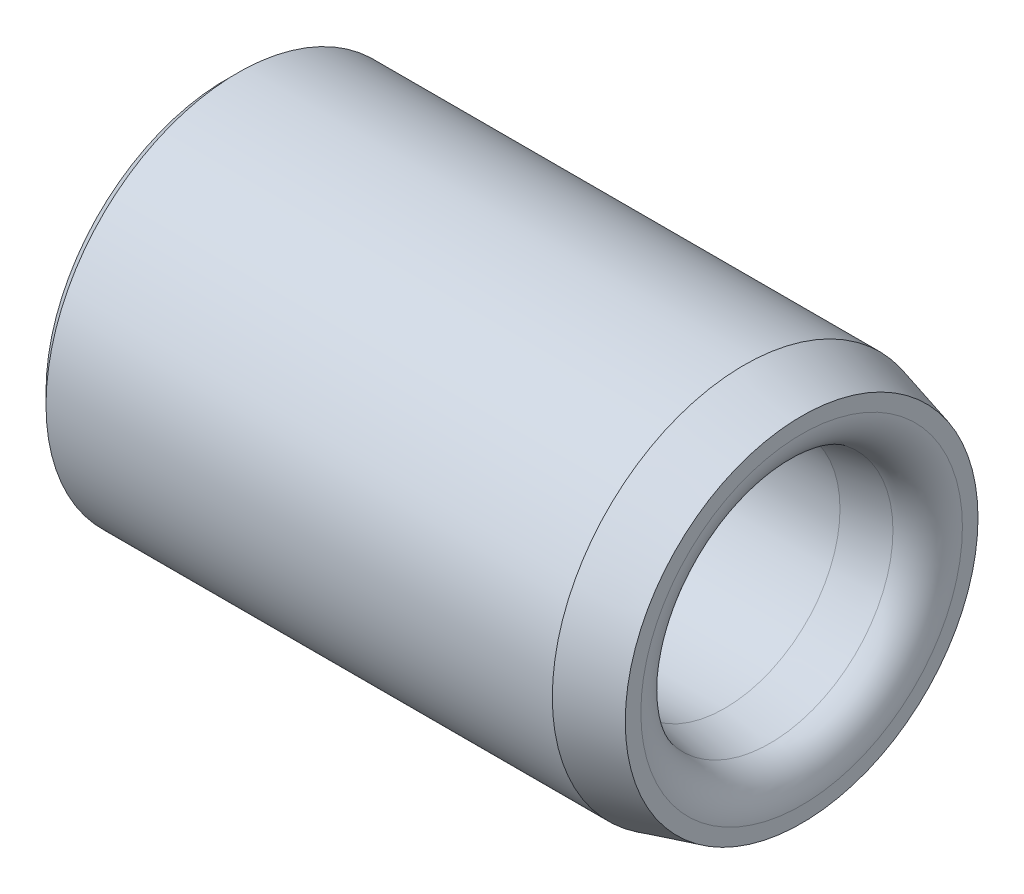
ISO-10303-21;
HEADER;
FILE_DESCRIPTION(('STEP AP214'),'2;1');
FILE_NAME('part.step','',(''),(''),'','','');
FILE_SCHEMA(('AUTOMOTIVE_DESIGN { 1 0 10303 214 1 1 1 1 }'));
ENDSEC;
DATA;
#1=APPLICATION_CONTEXT('core data for automotive mechanical design processes');
#2=APPLICATION_PROTOCOL_DEFINITION('international standard','automotive_design',2000,#1);
#3=PRODUCT_CONTEXT('',#1,'mechanical');
#4=PRODUCT('Part','Part','',(#3));
#5=PRODUCT_RELATED_PRODUCT_CATEGORY('part','',(#4));
#6=PRODUCT_DEFINITION_FORMATION('','',#4);
#7=PRODUCT_DEFINITION_CONTEXT('part definition',#1,'design');
#8=PRODUCT_DEFINITION('design','',#6,#7);
#9=PRODUCT_DEFINITION_SHAPE('','',#8);
#10=(LENGTH_UNIT() NAMED_UNIT(*) SI_UNIT(.MILLI.,.METRE.));
#11=(NAMED_UNIT(*) PLANE_ANGLE_UNIT() SI_UNIT($,.RADIAN.));
#12=(NAMED_UNIT(*) SI_UNIT($,.STERADIAN.) SOLID_ANGLE_UNIT());
#13=UNCERTAINTY_MEASURE_WITH_UNIT(LENGTH_MEASURE(1.E-05),#10,'distance_accuracy_value','');
#14=(GEOMETRIC_REPRESENTATION_CONTEXT(3) GLOBAL_UNCERTAINTY_ASSIGNED_CONTEXT((#13)) GLOBAL_UNIT_ASSIGNED_CONTEXT((#10,
#11,#12)) REPRESENTATION_CONTEXT('',''));
#15=CARTESIAN_POINT('',(0.,0.,0.));
#16=DIRECTION('',(0.,0.,1.));
#17=DIRECTION('',(1.,0.,0.));
#18=AXIS2_PLACEMENT_3D('',#15,#16,#17);
#19=CARTESIAN_POINT('',(0.,0.,0.));
#20=DIRECTION('',(-1.,0.,0.));
#21=DIRECTION('',(0.,0.,1.));
#22=AXIS2_PLACEMENT_3D('',#19,#20,#21);
#23=CYLINDRICAL_SURFACE('',#22,3.);
#24=CARTESIAN_POINT('',(13.,0.,0.));
#25=DIRECTION('',(-1.,0.,0.));
#26=DIRECTION('',(0.,0.,1.));
#27=AXIS2_PLACEMENT_3D('',#24,#25,#26);
#28=CIRCLE('',#27,3.);
#29=CARTESIAN_POINT('',(13.,0.,3.));
#30=VERTEX_POINT('',#29);
#31=EDGE_CURVE('E68',#30,#30,#28,.F.);
#32=ORIENTED_EDGE('',*,*,#31,.T.);
#33=EDGE_LOOP('',(#32));
#34=FACE_BOUND('',#33,.T.);
#35=CARTESIAN_POINT('',(2.,0.,0.));
#36=DIRECTION('',(1.,0.,0.));
#37=DIRECTION('',(0.,0.,-1.));
#38=AXIS2_PLACEMENT_3D('',#35,#36,#37);
#39=CIRCLE('',#38,3.);
#40=CARTESIAN_POINT('',(2.,0.,-3.));
#41=VERTEX_POINT('',#40);
#42=EDGE_CURVE('E72',#41,#41,#39,.F.);
#43=ORIENTED_EDGE('',*,*,#42,.T.);
#44=EDGE_LOOP('',(#43));
#45=FACE_BOUND('',#44,.T.);
#46=ADVANCED_FACE('F42',(#34,#45),#23,.F.);
#47=CARTESIAN_POINT('',(0.,3.,0.));
#48=DIRECTION('',(1.,0.,0.));
#49=DIRECTION('',(0.,0.,-1.));
#50=AXIS2_PLACEMENT_3D('',#47,#48,#49);
#51=PLANE('',#50);
#52=CARTESIAN_POINT('',(0.,0.,0.));
#53=DIRECTION('',(1.,0.,0.));
#54=DIRECTION('',(0.,0.,-1.));
#55=AXIS2_PLACEMENT_3D('',#52,#53,#54);
#56=CIRCLE('',#55,4.19175359259421);
#57=CARTESIAN_POINT('',(0.,0.,-4.19175359259421));
#58=VERTEX_POINT('',#57);
#59=EDGE_CURVE('E62',#58,#58,#56,.T.);
#60=ORIENTED_EDGE('',*,*,#59,.T.);
#61=EDGE_LOOP('',(#60));
#62=FACE_BOUND('',#61,.T.);
#63=CARTESIAN_POINT('',(0.,0.,0.));
#64=DIRECTION('',(1.,0.,0.));
#65=DIRECTION('',(0.,0.,-1.));
#66=AXIS2_PLACEMENT_3D('',#63,#64,#65);
#67=CIRCLE('',#66,4.7);
#68=CARTESIAN_POINT('',(0.,0.,-4.7));
#69=VERTEX_POINT('',#68);
#70=EDGE_CURVE('E88',#69,#69,#67,.F.);
#71=ORIENTED_EDGE('',*,*,#70,.T.);
#72=EDGE_LOOP('',(#71));
#73=FACE_BOUND('',#72,.T.);
#74=ADVANCED_FACE('F94',(#62,#73),#51,.F.);
#75=CARTESIAN_POINT('',(0.,0.,0.));
#76=DIRECTION('',(-1.,0.,0.));
#77=DIRECTION('',(0.,0.,1.));
#78=AXIS2_PLACEMENT_3D('',#75,#76,#77);
#79=CYLINDRICAL_SURFACE('',#78,5.);
#80=CARTESIAN_POINT('',(13.5,0.,0.));
#81=DIRECTION('',(-1.,0.,0.));
#82=DIRECTION('',(0.,0.,1.));
#83=AXIS2_PLACEMENT_3D('',#80,#81,#82);
#84=CIRCLE('',#83,5.);
#85=CARTESIAN_POINT('',(13.5,0.,5.));
#86=VERTEX_POINT('',#85);
#87=EDGE_CURVE('E80',#86,#86,#84,.T.);
#88=ORIENTED_EDGE('',*,*,#87,.T.);
#89=EDGE_LOOP('',(#88));
#90=FACE_BOUND('',#89,.T.);
#91=CARTESIAN_POINT('',(0.299999999999999,0.,0.));
#92=DIRECTION('',(1.,0.,0.));
#93=DIRECTION('',(0.,0.,-1.));
#94=AXIS2_PLACEMENT_3D('',#91,#92,#93);
#95=CIRCLE('',#94,5.);
#96=CARTESIAN_POINT('',(0.299999999999999,0.,-5.));
#97=VERTEX_POINT('',#96);
#98=EDGE_CURVE('E84',#97,#97,#95,.T.);
#99=ORIENTED_EDGE('',*,*,#98,.T.);
#100=EDGE_LOOP('',(#99));
#101=FACE_BOUND('',#100,.T.);
#102=ADVANCED_FACE('F109',(#90,#101),#79,.T.);
#103=CARTESIAN_POINT('',(15.,5.,0.));
#104=DIRECTION('',(-1.,0.,0.));
#105=DIRECTION('',(0.,0.,1.));
#106=AXIS2_PLACEMENT_3D('',#103,#104,#105);
#107=PLANE('',#106);
#108=CARTESIAN_POINT('',(15.,0.,0.));
#109=DIRECTION('',(-1.,0.,0.));
#110=DIRECTION('',(0.,0.,1.));
#111=AXIS2_PLACEMENT_3D('',#108,#109,#110);
#112=CIRCLE('',#111,4.19175359259421);
#113=CARTESIAN_POINT('',(15.,0.,4.19175359259421));
#114=VERTEX_POINT('',#113);
#115=EDGE_CURVE('E50',#114,#114,#112,.T.);
#116=ORIENTED_EDGE('',*,*,#115,.T.);
#117=EDGE_LOOP('',(#116));
#118=FACE_BOUND('',#117,.T.);
#119=CARTESIAN_POINT('',(15.,0.,0.));
#120=DIRECTION('',(-1.,0.,0.));
#121=DIRECTION('',(0.,0.,1.));
#122=AXIS2_PLACEMENT_3D('',#119,#120,#121);
#123=CIRCLE('',#122,4.59807621135331);
#124=CARTESIAN_POINT('',(15.,0.,4.59807621135331));
#125=VERTEX_POINT('',#124);
#126=EDGE_CURVE('E76',#125,#125,#123,.F.);
#127=ORIENTED_EDGE('',*,*,#126,.T.);
#128=EDGE_LOOP('',(#127));
#129=FACE_BOUND('',#128,.T.);
#130=ADVANCED_FACE('F99',(#118,#129),#107,.F.);
#131=CARTESIAN_POINT('',(0.,0.,0.));
#132=DIRECTION('',(1.,0.,0.));
#133=DIRECTION('',(0.,0.,-1.));
#134=AXIS2_PLACEMENT_3D('',#131,#132,#133);
#135=CONICAL_SURFACE('',#134,4.7,0.785398163397445);
#136=ORIENTED_EDGE('',*,*,#98,.F.);
#137=EDGE_LOOP('',(#136));
#138=FACE_BOUND('',#137,.T.);
#139=ORIENTED_EDGE('',*,*,#70,.F.);
#140=EDGE_LOOP('',(#139));
#141=FACE_BOUND('',#140,.T.);
#142=ADVANCED_FACE('F96',(#138,#141),#135,.T.);
#143=CARTESIAN_POINT('',(13.5,0.,0.));
#144=DIRECTION('',(-1.,0.,0.));
#145=DIRECTION('',(0.,0.,1.));
#146=AXIS2_PLACEMENT_3D('',#143,#144,#145);
#147=CONICAL_SURFACE('',#146,5.,0.261799387799148);
#148=ORIENTED_EDGE('',*,*,#126,.F.);
#149=EDGE_LOOP('',(#148));
#150=FACE_BOUND('',#149,.T.);
#151=ORIENTED_EDGE('',*,*,#87,.F.);
#152=EDGE_LOOP('',(#151));
#153=FACE_BOUND('',#152,.T.);
#154=ADVANCED_FACE('F98',(#150,#153),#147,.T.);
#155=CARTESIAN_POINT('',(15.,0.,0.));
#156=DIRECTION('',(1.,0.,0.));
#157=DIRECTION('',(0.,0.,-1.));
#158=AXIS2_PLACEMENT_3D('',#155,#156,#157);
#159=CONICAL_SURFACE('',#158,3.35265396141693,0.17453292519943);
#160=CARTESIAN_POINT('',(14.1736481776669,0.,0.));
#161=DIRECTION('',(1.,0.,0.));
#162=DIRECTION('',(0.,0.,-1.));
#163=AXIS2_PLACEMENT_3D('',#160,#161,#162);
#164=CIRCLE('',#163,3.206945839582);
#165=CARTESIAN_POINT('',(14.1736481776669,0.,-3.206945839582));
#166=VERTEX_POINT('',#165);
#167=EDGE_CURVE('E10',#166,#166,#164,.T.);
#168=ORIENTED_EDGE('',*,*,#167,.T.);
#169=EDGE_LOOP('',(#168));
#170=FACE_BOUND('',#169,.T.);
#171=ORIENTED_EDGE('',*,*,#31,.F.);
#172=EDGE_LOOP('',(#171));
#173=FACE_BOUND('',#172,.T.);
#174=ADVANCED_FACE('F106',(#170,#173),#159,.F.);
#175=CARTESIAN_POINT('',(2.,0.,0.));
#176=DIRECTION('',(-1.,0.,0.));
#177=DIRECTION('',(0.,0.,1.));
#178=AXIS2_PLACEMENT_3D('',#175,#176,#177);
#179=CONICAL_SURFACE('',#178,3.,0.17453292519943);
#180=CARTESIAN_POINT('',(0.826351822333073,0.,0.));
#181=DIRECTION('',(-1.,0.,0.));
#182=DIRECTION('',(0.,0.,1.));
#183=AXIS2_PLACEMENT_3D('',#180,#181,#182);
#184=CIRCLE('',#183,3.206945839582);
#185=CARTESIAN_POINT('',(0.826351822333073,0.,3.206945839582));
#186=VERTEX_POINT('',#185);
#187=EDGE_CURVE('E56',#186,#186,#184,.T.);
#188=ORIENTED_EDGE('',*,*,#187,.T.);
#189=EDGE_LOOP('',(#188));
#190=FACE_BOUND('',#189,.T.);
#191=ORIENTED_EDGE('',*,*,#42,.F.);
#192=EDGE_LOOP('',(#191));
#193=FACE_BOUND('',#192,.T.);
#194=ADVANCED_FACE('F156',(#190,#193),#179,.F.);
#195=CARTESIAN_POINT('',(1.,0.,0.));
#196=DIRECTION('',(1.,0.,0.));
#197=DIRECTION('',(0.,0.,-1.));
#198=AXIS2_PLACEMENT_3D('',#195,#196,#197);
#199=TOROIDAL_SURFACE('',#198,4.19175359259421,1.);
#200=ORIENTED_EDGE('',*,*,#187,.F.);
#201=EDGE_LOOP('',(#200));
#202=FACE_BOUND('',#201,.T.);
#203=ORIENTED_EDGE('',*,*,#59,.F.);
#204=EDGE_LOOP('',(#203));
#205=FACE_BOUND('',#204,.T.);
#206=ADVANCED_FACE('F165',(#202,#205),#199,.T.);
#207=CARTESIAN_POINT('',(14.,0.,0.));
#208=DIRECTION('',(-1.,0.,0.));
#209=DIRECTION('',(0.,0.,1.));
#210=AXIS2_PLACEMENT_3D('',#207,#208,#209);
#211=TOROIDAL_SURFACE('',#210,4.19175359259421,1.);
#212=ORIENTED_EDGE('',*,*,#167,.F.);
#213=EDGE_LOOP('',(#212));
#214=FACE_BOUND('',#213,.T.);
#215=ORIENTED_EDGE('',*,*,#115,.F.);
#216=EDGE_LOOP('',(#215));
#217=FACE_BOUND('',#216,.T.);
#218=ADVANCED_FACE('F44',(#214,#217),#211,.T.);
#219=CLOSED_SHELL('',(#46,#74,#102,#130,#142,#154,#174,#194,#206,#218));
#220=MANIFOLD_SOLID_BREP('B2',#219);
#221=ADVANCED_BREP_SHAPE_REPRESENTATION('',(#18,#220),#14);
#222=SHAPE_DEFINITION_REPRESENTATION(#9,#221);
ENDSEC;
END-ISO-10303-21;
